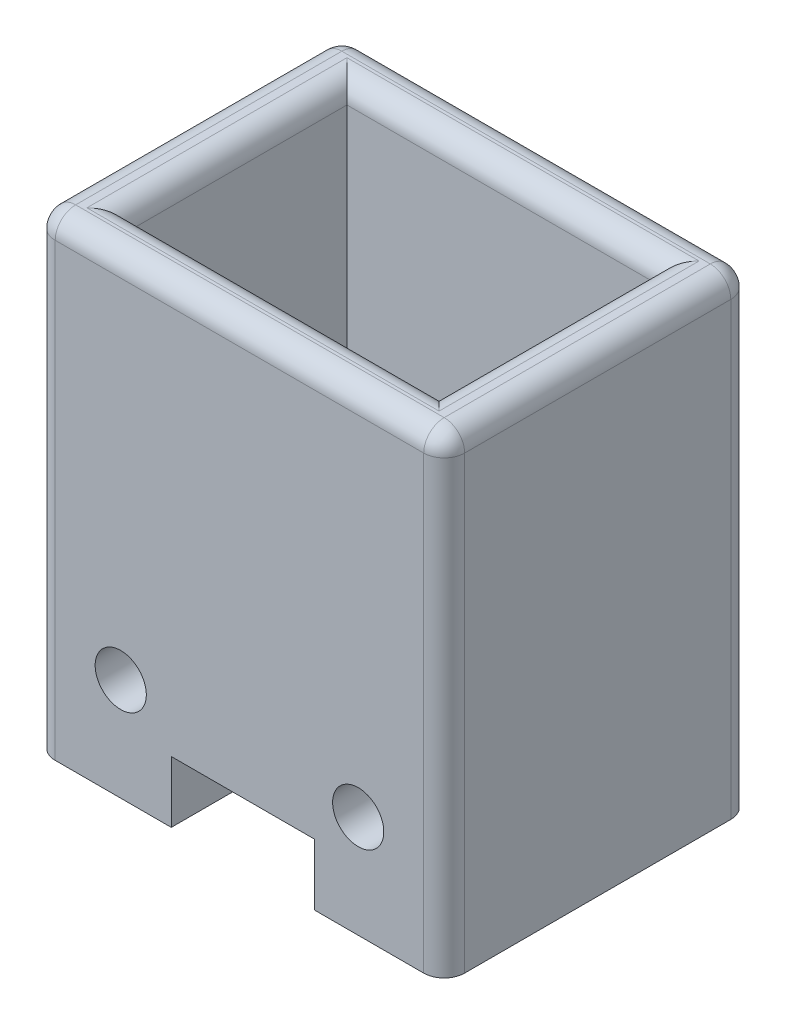
ISO-10303-21;
HEADER;
FILE_DESCRIPTION(('STEP AP214'),'2;1');
FILE_NAME('part.step','',(''),(''),'','','');
FILE_SCHEMA(('AUTOMOTIVE_DESIGN { 1 0 10303 214 1 1 1 1 }'));
ENDSEC;
DATA;
#1=APPLICATION_CONTEXT('core data for automotive mechanical design processes');
#2=APPLICATION_PROTOCOL_DEFINITION('international standard','automotive_design',2000,#1);
#3=PRODUCT_CONTEXT('',#1,'mechanical');
#4=PRODUCT('Part','Part','',(#3));
#5=PRODUCT_RELATED_PRODUCT_CATEGORY('part','',(#4));
#6=PRODUCT_DEFINITION_FORMATION('','',#4);
#7=PRODUCT_DEFINITION_CONTEXT('part definition',#1,'design');
#8=PRODUCT_DEFINITION('design','',#6,#7);
#9=PRODUCT_DEFINITION_SHAPE('','',#8);
#10=(LENGTH_UNIT() NAMED_UNIT(*) SI_UNIT(.MILLI.,.METRE.));
#11=(NAMED_UNIT(*) PLANE_ANGLE_UNIT() SI_UNIT($,.RADIAN.));
#12=(NAMED_UNIT(*) SI_UNIT($,.STERADIAN.) SOLID_ANGLE_UNIT());
#13=UNCERTAINTY_MEASURE_WITH_UNIT(LENGTH_MEASURE(1.E-05),#10,'distance_accuracy_value','');
#14=(GEOMETRIC_REPRESENTATION_CONTEXT(3) GLOBAL_UNCERTAINTY_ASSIGNED_CONTEXT((#13)) GLOBAL_UNIT_ASSIGNED_CONTEXT((#10,
#11,#12)) REPRESENTATION_CONTEXT('',''));
#15=CARTESIAN_POINT('',(0.,0.,0.));
#16=DIRECTION('',(0.,0.,1.));
#17=DIRECTION('',(1.,0.,0.));
#18=AXIS2_PLACEMENT_3D('',#15,#16,#17);
#19=CARTESIAN_POINT('',(0.,0.,0.));
#20=DIRECTION('',(0.,-1.,0.));
#21=DIRECTION('',(0.,0.,-1.));
#22=AXIS2_PLACEMENT_3D('',#19,#20,#21);
#23=PLANE('',#22);
#24=DIRECTION('',(1.,0.,0.));
#25=VECTOR('',#24,1.);
#26=CARTESIAN_POINT('',(-7.6,0.,5.35));
#27=LINE('',#26,#25);
#28=CARTESIAN_POINT('',(-7.6,0.,5.35));
#29=VERTEX_POINT('',#28);
#30=CARTESIAN_POINT('',(-3.33,0.,5.35));
#31=VERTEX_POINT('',#30);
#32=EDGE_CURVE('E285',#29,#31,#27,.T.);
#33=ORIENTED_EDGE('',*,*,#32,.T.);
#34=DIRECTION('',(0.,0.,-1.));
#35=VECTOR('',#34,1.);
#36=CARTESIAN_POINT('',(-3.33,0.,0.));
#37=LINE('',#36,#35);
#38=CARTESIAN_POINT('',(-3.33,0.,2.5));
#39=VERTEX_POINT('',#38);
#40=EDGE_CURVE('E490',#31,#39,#37,.T.);
#41=ORIENTED_EDGE('',*,*,#40,.T.);
#42=DIRECTION('',(-1.,0.,0.));
#43=VECTOR('',#42,1.);
#44=CARTESIAN_POINT('',(-3.33333333333333,0.,2.5));
#45=LINE('',#44,#43);
#46=CARTESIAN_POINT('',(-3.33333333333333,0.,2.5));
#47=VERTEX_POINT('',#46);
#48=EDGE_CURVE('E493',#39,#47,#45,.T.);
#49=ORIENTED_EDGE('',*,*,#48,.T.);
#50=DIRECTION('',(0.,0.,-1.));
#51=VECTOR('',#50,1.);
#52=CARTESIAN_POINT('',(-3.33333333333333,0.,2.5));
#53=LINE('',#52,#51);
#54=CARTESIAN_POINT('',(-3.33333333333333,0.,-2.5));
#55=VERTEX_POINT('',#54);
#56=EDGE_CURVE('E507',#47,#55,#53,.T.);
#57=ORIENTED_EDGE('',*,*,#56,.T.);
#58=DIRECTION('',(1.,0.,0.));
#59=VECTOR('',#58,1.);
#60=CARTESIAN_POINT('',(-3.33333333333333,0.,-2.5));
#61=LINE('',#60,#59);
#62=CARTESIAN_POINT('',(-3.33,0.,-2.5));
#63=VERTEX_POINT('',#62);
#64=EDGE_CURVE('E511',#55,#63,#61,.T.);
#65=ORIENTED_EDGE('',*,*,#64,.T.);
#66=CARTESIAN_POINT('',(-3.33,0.,-5.35));
#67=VERTEX_POINT('',#66);
#68=EDGE_CURVE('E63',#63,#67,#37,.T.);
#69=ORIENTED_EDGE('',*,*,#68,.T.);
#70=DIRECTION('',(-1.,0.,0.));
#71=VECTOR('',#70,1.);
#72=CARTESIAN_POINT('',(-7.6,0.,-5.35));
#73=LINE('',#72,#71);
#74=CARTESIAN_POINT('',(-7.6,0.,-5.35));
#75=VERTEX_POINT('',#74);
#76=EDGE_CURVE('E270',#67,#75,#73,.T.);
#77=ORIENTED_EDGE('',*,*,#76,.T.);
#78=DIRECTION('',(0.,0.,1.));
#79=VECTOR('',#78,1.);
#80=CARTESIAN_POINT('',(-7.6,0.,-5.35));
#81=LINE('',#80,#79);
#82=EDGE_CURVE('E280',#75,#29,#81,.T.);
#83=ORIENTED_EDGE('',*,*,#82,.T.);
#84=EDGE_LOOP('',(#33,#41,#49,#57,#65,#69,#77,#83));
#85=FACE_BOUND('',#84,.T.);
#86=ADVANCED_FACE('F47',(#85),#23,.F.);
#87=CARTESIAN_POINT('',(0.,-2.,0.));
#88=DIRECTION('',(0.,-1.,0.));
#89=DIRECTION('',(0.,0.,-1.));
#90=AXIS2_PLACEMENT_3D('',#87,#88,#89);
#91=PLANE('',#90);
#92=DIRECTION('',(0.,0.,1.));
#93=VECTOR('',#92,1.);
#94=CARTESIAN_POINT('',(-3.33,-2.,-7.5));
#95=LINE('',#94,#93);
#96=CARTESIAN_POINT('',(-3.33,-2.,2.5));
#97=VERTEX_POINT('',#96);
#98=CARTESIAN_POINT('',(-3.33,-2.,7.5));
#99=VERTEX_POINT('',#98);
#100=EDGE_CURVE('E244',#97,#99,#95,.T.);
#101=ORIENTED_EDGE('',*,*,#100,.T.);
#102=DIRECTION('',(-1.,0.,0.));
#103=VECTOR('',#102,1.);
#104=CARTESIAN_POINT('',(-10.,-2.,7.5));
#105=LINE('',#104,#103);
#106=CARTESIAN_POINT('',(-9.,-2.,7.5));
#107=VERTEX_POINT('',#106);
#108=EDGE_CURVE('E530',#99,#107,#105,.T.);
#109=ORIENTED_EDGE('',*,*,#108,.T.);
#110=CARTESIAN_POINT('',(-9.,-2.,6.5));
#111=DIRECTION('',(0.,-1.,0.));
#112=DIRECTION('',(0.,0.,-1.));
#113=AXIS2_PLACEMENT_3D('',#110,#111,#112);
#114=CIRCLE('',#113,1.);
#115=CARTESIAN_POINT('',(-10.,-2.,6.5));
#116=VERTEX_POINT('',#115);
#117=EDGE_CURVE('E393',#107,#116,#114,.T.);
#118=ORIENTED_EDGE('',*,*,#117,.T.);
#119=DIRECTION('',(0.,0.,-1.));
#120=VECTOR('',#119,1.);
#121=CARTESIAN_POINT('',(-10.,-2.,7.5));
#122=LINE('',#121,#120);
#123=CARTESIAN_POINT('',(-10.,-2.,-6.5));
#124=VERTEX_POINT('',#123);
#125=EDGE_CURVE('E272',#116,#124,#122,.T.);
#126=ORIENTED_EDGE('',*,*,#125,.T.);
#127=CARTESIAN_POINT('',(-9.00000000000001,-2.,-6.5));
#128=DIRECTION('',(0.,-1.,0.));
#129=DIRECTION('',(0.,0.,-1.));
#130=AXIS2_PLACEMENT_3D('',#127,#128,#129);
#131=CIRCLE('',#130,1.);
#132=CARTESIAN_POINT('',(-9.00000000000001,-2.,-7.5));
#133=VERTEX_POINT('',#132);
#134=EDGE_CURVE('E262',#124,#133,#131,.T.);
#135=ORIENTED_EDGE('',*,*,#134,.T.);
#136=DIRECTION('',(1.,0.,0.));
#137=VECTOR('',#136,1.);
#138=CARTESIAN_POINT('',(-10.,-2.,-7.5));
#139=LINE('',#138,#137);
#140=CARTESIAN_POINT('',(-3.33,-2.,-7.5));
#141=VERTEX_POINT('',#140);
#142=EDGE_CURVE('E249',#133,#141,#139,.T.);
#143=ORIENTED_EDGE('',*,*,#142,.T.);
#144=CARTESIAN_POINT('',(-3.33,-2.,-2.5));
#145=VERTEX_POINT('',#144);
#146=EDGE_CURVE('E232',#141,#145,#95,.T.);
#147=ORIENTED_EDGE('',*,*,#146,.T.);
#148=DIRECTION('',(1.,0.,0.));
#149=VECTOR('',#148,1.);
#150=CARTESIAN_POINT('',(-3.33333333333333,-2.,-2.5));
#151=LINE('',#150,#149);
#152=CARTESIAN_POINT('',(-3.33333333333333,-2.,-2.5));
#153=VERTEX_POINT('',#152);
#154=EDGE_CURVE('E516',#153,#145,#151,.T.);
#155=ORIENTED_EDGE('',*,*,#154,.F.);
#156=DIRECTION('',(0.,0.,-1.));
#157=VECTOR('',#156,1.);
#158=CARTESIAN_POINT('',(-3.33333333333333,-2.,2.5));
#159=LINE('',#158,#157);
#160=CARTESIAN_POINT('',(-3.33333333333333,-2.,2.5));
#161=VERTEX_POINT('',#160);
#162=EDGE_CURVE('E631',#161,#153,#159,.T.);
#163=ORIENTED_EDGE('',*,*,#162,.F.);
#164=DIRECTION('',(-1.,0.,0.));
#165=VECTOR('',#164,1.);
#166=CARTESIAN_POINT('',(-3.33333333333333,-2.,2.5));
#167=LINE('',#166,#165);
#168=EDGE_CURVE('E521',#97,#161,#167,.T.);
#169=ORIENTED_EDGE('',*,*,#168,.F.);
#170=EDGE_LOOP('',(#101,#109,#118,#126,#135,#143,#147,#155,#163,#169));
#171=FACE_BOUND('',#170,.T.);
#172=ADVANCED_FACE('F259',(#171),#91,.T.);
#173=CARTESIAN_POINT('',(0.,21.,0.));
#174=DIRECTION('',(0.,1.,0.));
#175=DIRECTION('',(0.,0.,1.));
#176=AXIS2_PLACEMENT_3D('',#173,#174,#175);
#177=PLANE('',#176);
#178=DIRECTION('',(1.,0.,0.));
#179=VECTOR('',#178,1.);
#180=CARTESIAN_POINT('',(0.,21.,6.35));
#181=LINE('',#180,#179);
#182=CARTESIAN_POINT('',(8.6,21.,6.35));
#183=VERTEX_POINT('',#182);
#184=CARTESIAN_POINT('',(-8.6,21.,6.35));
#185=VERTEX_POINT('',#184);
#186=EDGE_CURVE('E337',#183,#185,#181,.F.);
#187=ORIENTED_EDGE('',*,*,#186,.T.);
#188=DIRECTION('',(0.,0.,1.));
#189=VECTOR('',#188,1.);
#190=CARTESIAN_POINT('',(-8.6,21.,0.));
#191=LINE('',#190,#189);
#192=CARTESIAN_POINT('',(-8.6,21.,-6.35));
#193=VERTEX_POINT('',#192);
#194=EDGE_CURVE('E340',#185,#193,#191,.F.);
#195=ORIENTED_EDGE('',*,*,#194,.T.);
#196=DIRECTION('',(-1.,0.,0.));
#197=VECTOR('',#196,1.);
#198=CARTESIAN_POINT('',(0.,21.,-6.35));
#199=LINE('',#198,#197);
#200=CARTESIAN_POINT('',(8.6,21.,-6.35));
#201=VERTEX_POINT('',#200);
#202=EDGE_CURVE('E331',#193,#201,#199,.F.);
#203=ORIENTED_EDGE('',*,*,#202,.T.);
#204=DIRECTION('',(0.,0.,-1.));
#205=VECTOR('',#204,1.);
#206=CARTESIAN_POINT('',(8.6,21.,0.));
#207=LINE('',#206,#205);
#208=EDGE_CURVE('E334',#201,#183,#207,.F.);
#209=ORIENTED_EDGE('',*,*,#208,.T.);
#210=EDGE_LOOP('',(#187,#195,#203,#209));
#211=FACE_BOUND('',#210,.T.);
#212=DIRECTION('',(0.,0.,1.));
#213=VECTOR('',#212,1.);
#214=CARTESIAN_POINT('',(-9.,21.,7.5));
#215=LINE('',#214,#213);
#216=CARTESIAN_POINT('',(-9.00000000000001,21.,-6.5));
#217=VERTEX_POINT('',#216);
#218=CARTESIAN_POINT('',(-9.,21.,6.5));
#219=VERTEX_POINT('',#218);
#220=EDGE_CURVE('E324',#217,#219,#215,.T.);
#221=ORIENTED_EDGE('',*,*,#220,.T.);
#222=DIRECTION('',(1.,0.,0.));
#223=VECTOR('',#222,1.);
#224=CARTESIAN_POINT('',(10.,21.,6.5));
#225=LINE('',#224,#223);
#226=CARTESIAN_POINT('',(9.,21.,6.5));
#227=VERTEX_POINT('',#226);
#228=EDGE_CURVE('E327',#219,#227,#225,.T.);
#229=ORIENTED_EDGE('',*,*,#228,.T.);
#230=DIRECTION('',(0.,0.,-1.));
#231=VECTOR('',#230,1.);
#232=CARTESIAN_POINT('',(9.,21.,-7.5));
#233=LINE('',#232,#231);
#234=CARTESIAN_POINT('',(9.,21.,-6.5));
#235=VERTEX_POINT('',#234);
#236=EDGE_CURVE('E318',#227,#235,#233,.T.);
#237=ORIENTED_EDGE('',*,*,#236,.T.);
#238=DIRECTION('',(-1.,0.,0.));
#239=VECTOR('',#238,1.);
#240=CARTESIAN_POINT('',(-10.,21.,-6.5));
#241=LINE('',#240,#239);
#242=EDGE_CURVE('E321',#235,#217,#241,.T.);
#243=ORIENTED_EDGE('',*,*,#242,.T.);
#244=EDGE_LOOP('',(#221,#229,#237,#243));
#245=FACE_BOUND('',#244,.T.);
#246=ADVANCED_FACE('F658',(#211,#245),#177,.T.);
#247=CARTESIAN_POINT('',(10.,21.,-7.5));
#248=DIRECTION('',(-1.,0.,0.));
#249=DIRECTION('',(0.,0.,1.));
#250=AXIS2_PLACEMENT_3D('',#247,#248,#249);
#251=PLANE('',#250);
#252=DIRECTION('',(0.,0.,1.));
#253=VECTOR('',#252,1.);
#254=CARTESIAN_POINT('',(10.,-2.,7.5));
#255=LINE('',#254,#253);
#256=CARTESIAN_POINT('',(10.,-2.,-6.5));
#257=VERTEX_POINT('',#256);
#258=CARTESIAN_POINT('',(10.,-2.,6.5));
#259=VERTEX_POINT('',#258);
#260=EDGE_CURVE('E527',#257,#259,#255,.T.);
#261=ORIENTED_EDGE('',*,*,#260,.F.);
#262=DIRECTION('',(0.,-1.,0.));
#263=VECTOR('',#262,1.);
#264=CARTESIAN_POINT('',(10.,21.,-6.5));
#265=LINE('',#264,#263);
#266=CARTESIAN_POINT('',(10.,20.,-6.5));
#267=VERTEX_POINT('',#266);
#268=EDGE_CURVE('E71',#257,#267,#265,.F.);
#269=ORIENTED_EDGE('',*,*,#268,.T.);
#270=DIRECTION('',(0.,0.,-1.));
#271=VECTOR('',#270,1.);
#272=CARTESIAN_POINT('',(10.,20.,7.5));
#273=LINE('',#272,#271);
#274=CARTESIAN_POINT('',(10.,20.,6.5));
#275=VERTEX_POINT('',#274);
#276=EDGE_CURVE('E386',#267,#275,#273,.F.);
#277=ORIENTED_EDGE('',*,*,#276,.T.);
#278=DIRECTION('',(0.,-1.,0.));
#279=VECTOR('',#278,1.);
#280=CARTESIAN_POINT('',(10.,21.,6.5));
#281=LINE('',#280,#279);
#282=EDGE_CURVE('E383',#275,#259,#281,.T.);
#283=ORIENTED_EDGE('',*,*,#282,.T.);
#284=EDGE_LOOP('',(#261,#269,#277,#283));
#285=FACE_BOUND('',#284,.T.);
#286=ADVANCED_FACE('F772',(#285),#251,.F.);
#287=CARTESIAN_POINT('',(-10.,21.,-7.5));
#288=DIRECTION('',(0.,0.,1.));
#289=DIRECTION('',(1.,0.,0.));
#290=AXIS2_PLACEMENT_3D('',#287,#288,#289);
#291=PLANE('',#290);
#292=CARTESIAN_POINT('',(-5.80000000000015,2.99999999999671,-7.5));
#293=DIRECTION('',(0.,0.,-1.));
#294=DIRECTION('',(-1.,0.,0.));
#295=AXIS2_PLACEMENT_3D('',#292,#293,#294);
#296=CIRCLE('',#295,1.24999999999906);
#297=CARTESIAN_POINT('',(-7.04999999999921,2.99999999999671,-7.5));
#298=VERTEX_POINT('',#297);
#299=EDGE_CURVE('E616',#298,#298,#296,.T.);
#300=ORIENTED_EDGE('',*,*,#299,.F.);
#301=EDGE_LOOP('',(#300));
#302=FACE_BOUND('',#301,.T.);
#303=CARTESIAN_POINT('',(5.79999999999985,2.99999999999671,-7.5));
#304=DIRECTION('',(0.,0.,-1.));
#305=DIRECTION('',(-1.,0.,0.));
#306=AXIS2_PLACEMENT_3D('',#303,#304,#305);
#307=CIRCLE('',#306,1.24999999999906);
#308=CARTESIAN_POINT('',(4.55000000000079,2.99999999999671,-7.5));
#309=VERTEX_POINT('',#308);
#310=EDGE_CURVE('E620',#309,#309,#307,.T.);
#311=ORIENTED_EDGE('',*,*,#310,.F.);
#312=EDGE_LOOP('',(#311));
#313=FACE_BOUND('',#312,.T.);
#314=DIRECTION('',(-1.,0.,0.));
#315=VECTOR('',#314,1.);
#316=CARTESIAN_POINT('',(-3.33,1.,-7.5));
#317=LINE('',#316,#315);
#318=CARTESIAN_POINT('',(3.67,1.,-7.5));
#319=VERTEX_POINT('',#318);
#320=CARTESIAN_POINT('',(-3.33,1.,-7.5));
#321=VERTEX_POINT('',#320);
#322=EDGE_CURVE('E253',#319,#321,#317,.T.);
#323=ORIENTED_EDGE('',*,*,#322,.T.);
#324=DIRECTION('',(0.,-1.,0.));
#325=VECTOR('',#324,1.);
#326=CARTESIAN_POINT('',(-3.33,-2.,-7.5));
#327=LINE('',#326,#325);
#328=EDGE_CURVE('E236',#321,#141,#327,.T.);
#329=ORIENTED_EDGE('',*,*,#328,.T.);
#330=ORIENTED_EDGE('',*,*,#142,.F.);
#331=DIRECTION('',(0.,-1.,0.));
#332=VECTOR('',#331,1.);
#333=CARTESIAN_POINT('',(-9.00000000000001,21.,-7.5));
#334=LINE('',#333,#332);
#335=CARTESIAN_POINT('',(-9.00000000000001,20.,-7.5));
#336=VERTEX_POINT('',#335);
#337=EDGE_CURVE('E373',#133,#336,#334,.F.);
#338=ORIENTED_EDGE('',*,*,#337,.T.);
#339=DIRECTION('',(-1.,0.,0.));
#340=VECTOR('',#339,1.);
#341=CARTESIAN_POINT('',(10.,20.,-7.5));
#342=LINE('',#341,#340);
#343=CARTESIAN_POINT('',(9.,20.,-7.5));
#344=VERTEX_POINT('',#343);
#345=EDGE_CURVE('E376',#336,#344,#342,.F.);
#346=ORIENTED_EDGE('',*,*,#345,.T.);
#347=DIRECTION('',(0.,-1.,0.));
#348=VECTOR('',#347,1.);
#349=CARTESIAN_POINT('',(9.,21.,-7.5));
#350=LINE('',#349,#348);
#351=CARTESIAN_POINT('',(9.,-2.,-7.5));
#352=VERTEX_POINT('',#351);
#353=EDGE_CURVE('E379',#344,#352,#350,.T.);
#354=ORIENTED_EDGE('',*,*,#353,.T.);
#355=CARTESIAN_POINT('',(3.67,-2.,-7.5));
#356=VERTEX_POINT('',#355);
#357=EDGE_CURVE('E265',#356,#352,#139,.T.);
#358=ORIENTED_EDGE('',*,*,#357,.F.);
#359=DIRECTION('',(0.,1.,0.));
#360=VECTOR('',#359,1.);
#361=CARTESIAN_POINT('',(3.67,-2.,-7.5));
#362=LINE('',#361,#360);
#363=EDGE_CURVE('E255',#356,#319,#362,.T.);
#364=ORIENTED_EDGE('',*,*,#363,.T.);
#365=EDGE_LOOP('',(#323,#329,#330,#338,#346,#354,#358,#364));
#366=FACE_BOUND('',#365,.T.);
#367=ADVANCED_FACE('F248',(#302,#313,#366),#291,.F.);
#368=CARTESIAN_POINT('',(-10.,21.,-7.5));
#369=DIRECTION('',(1.,0.,0.));
#370=DIRECTION('',(0.,0.,-1.));
#371=AXIS2_PLACEMENT_3D('',#368,#369,#370);
#372=PLANE('',#371);
#373=ORIENTED_EDGE('',*,*,#125,.F.);
#374=DIRECTION('',(0.,-1.,0.));
#375=VECTOR('',#374,1.);
#376=CARTESIAN_POINT('',(-10.,21.,6.5));
#377=LINE('',#376,#375);
#378=CARTESIAN_POINT('',(-10.,20.,6.5));
#379=VERTEX_POINT('',#378);
#380=EDGE_CURVE('E370',#116,#379,#377,.F.);
#381=ORIENTED_EDGE('',*,*,#380,.T.);
#382=DIRECTION('',(0.,0.,1.));
#383=VECTOR('',#382,1.);
#384=CARTESIAN_POINT('',(-10.,20.,-7.5));
#385=LINE('',#384,#383);
#386=CARTESIAN_POINT('',(-10.,20.,-6.5));
#387=VERTEX_POINT('',#386);
#388=EDGE_CURVE('E367',#379,#387,#385,.F.);
#389=ORIENTED_EDGE('',*,*,#388,.T.);
#390=DIRECTION('',(0.,-1.,0.));
#391=VECTOR('',#390,1.);
#392=CARTESIAN_POINT('',(-10.,21.,-6.5));
#393=LINE('',#392,#391);
#394=EDGE_CURVE('E364',#387,#124,#393,.T.);
#395=ORIENTED_EDGE('',*,*,#394,.T.);
#396=EDGE_LOOP('',(#373,#381,#389,#395));
#397=FACE_BOUND('',#396,.T.);
#398=ADVANCED_FACE('F553',(#397),#372,.F.);
#399=CARTESIAN_POINT('',(-10.,21.,7.5));
#400=DIRECTION('',(0.,0.,-1.));
#401=DIRECTION('',(-1.,0.,0.));
#402=AXIS2_PLACEMENT_3D('',#399,#400,#401);
#403=PLANE('',#402);
#404=CARTESIAN_POINT('',(-5.80000000000015,2.99999999999671,7.5));
#405=DIRECTION('',(0.,0.,-1.));
#406=DIRECTION('',(-1.,0.,0.));
#407=AXIS2_PLACEMENT_3D('',#404,#405,#406);
#408=CIRCLE('',#407,1.24999999999906);
#409=CARTESIAN_POINT('',(-7.04999999999921,2.99999999999671,7.5));
#410=VERTEX_POINT('',#409);
#411=EDGE_CURVE('E309',#410,#410,#408,.T.);
#412=ORIENTED_EDGE('',*,*,#411,.T.);
#413=EDGE_LOOP('',(#412));
#414=FACE_BOUND('',#413,.T.);
#415=CARTESIAN_POINT('',(5.79999999999985,2.99999999999671,7.5));
#416=DIRECTION('',(0.,0.,-1.));
#417=DIRECTION('',(-1.,0.,0.));
#418=AXIS2_PLACEMENT_3D('',#415,#416,#417);
#419=CIRCLE('',#418,1.24999999999906);
#420=CARTESIAN_POINT('',(4.55000000000079,2.99999999999671,7.5));
#421=VERTEX_POINT('',#420);
#422=EDGE_CURVE('E417',#421,#421,#419,.T.);
#423=ORIENTED_EDGE('',*,*,#422,.T.);
#424=EDGE_LOOP('',(#423));
#425=FACE_BOUND('',#424,.T.);
#426=ORIENTED_EDGE('',*,*,#108,.F.);
#427=DIRECTION('',(0.,-1.,0.));
#428=VECTOR('',#427,1.);
#429=CARTESIAN_POINT('',(-3.33,-2.,7.5));
#430=LINE('',#429,#428);
#431=CARTESIAN_POINT('',(-3.33,1.,7.5));
#432=VERTEX_POINT('',#431);
#433=EDGE_CURVE('E689',#432,#99,#430,.T.);
#434=ORIENTED_EDGE('',*,*,#433,.F.);
#435=DIRECTION('',(-1.,0.,0.));
#436=VECTOR('',#435,1.);
#437=CARTESIAN_POINT('',(-3.33,1.,7.5));
#438=LINE('',#437,#436);
#439=CARTESIAN_POINT('',(3.67,1.,7.5));
#440=VERTEX_POINT('',#439);
#441=EDGE_CURVE('E256',#440,#432,#438,.T.);
#442=ORIENTED_EDGE('',*,*,#441,.F.);
#443=DIRECTION('',(0.,1.,0.));
#444=VECTOR('',#443,1.);
#445=CARTESIAN_POINT('',(3.67,-2.,7.5));
#446=LINE('',#445,#444);
#447=CARTESIAN_POINT('',(3.67,-2.,7.5));
#448=VERTEX_POINT('',#447);
#449=EDGE_CURVE('E686',#448,#440,#446,.T.);
#450=ORIENTED_EDGE('',*,*,#449,.F.);
#451=CARTESIAN_POINT('',(9.,-2.,7.5));
#452=VERTEX_POINT('',#451);
#453=EDGE_CURVE('E531',#452,#448,#105,.T.);
#454=ORIENTED_EDGE('',*,*,#453,.F.);
#455=DIRECTION('',(0.,-1.,0.));
#456=VECTOR('',#455,1.);
#457=CARTESIAN_POINT('',(9.,21.,7.5));
#458=LINE('',#457,#456);
#459=CARTESIAN_POINT('',(9.,20.,7.5));
#460=VERTEX_POINT('',#459);
#461=EDGE_CURVE('E361',#452,#460,#458,.F.);
#462=ORIENTED_EDGE('',*,*,#461,.T.);
#463=DIRECTION('',(1.,0.,0.));
#464=VECTOR('',#463,1.);
#465=CARTESIAN_POINT('',(-10.,20.,7.5));
#466=LINE('',#465,#464);
#467=CARTESIAN_POINT('',(-9.,20.,7.5));
#468=VERTEX_POINT('',#467);
#469=EDGE_CURVE('E357',#460,#468,#466,.F.);
#470=ORIENTED_EDGE('',*,*,#469,.T.);
#471=DIRECTION('',(0.,-1.,0.));
#472=VECTOR('',#471,1.);
#473=CARTESIAN_POINT('',(-9.,21.,7.5));
#474=LINE('',#473,#472);
#475=EDGE_CURVE('E353',#468,#107,#474,.T.);
#476=ORIENTED_EDGE('',*,*,#475,.T.);
#477=EDGE_LOOP('',(#426,#434,#442,#450,#454,#462,#470,#476));
#478=FACE_BOUND('',#477,.T.);
#479=ADVANCED_FACE('F545',(#414,#425,#478),#403,.F.);
#480=CARTESIAN_POINT('',(7.6,21.,-5.35));
#481=DIRECTION('',(-1.,0.,0.));
#482=DIRECTION('',(0.,0.,1.));
#483=AXIS2_PLACEMENT_3D('',#480,#481,#482);
#484=PLANE('',#483);
#485=DIRECTION('',(0.,-1.,0.));
#486=VECTOR('',#485,1.);
#487=CARTESIAN_POINT('',(7.6,21.,5.35));
#488=LINE('',#487,#486);
#489=CARTESIAN_POINT('',(7.6,20.,5.35));
#490=VERTEX_POINT('',#489);
#491=CARTESIAN_POINT('',(7.6,0.,5.35));
#492=VERTEX_POINT('',#491);
#493=EDGE_CURVE('E289',#490,#492,#488,.T.);
#494=ORIENTED_EDGE('',*,*,#493,.F.);
#495=DIRECTION('',(0.,0.,-1.));
#496=VECTOR('',#495,1.);
#497=CARTESIAN_POINT('',(7.6,20.,-5.35));
#498=LINE('',#497,#496);
#499=CARTESIAN_POINT('',(7.6,20.,-5.35));
#500=VERTEX_POINT('',#499);
#501=EDGE_CURVE('E347',#490,#500,#498,.T.);
#502=ORIENTED_EDGE('',*,*,#501,.T.);
#503=DIRECTION('',(0.,-1.,0.));
#504=VECTOR('',#503,1.);
#505=CARTESIAN_POINT('',(7.6,21.,-5.35));
#506=LINE('',#505,#504);
#507=CARTESIAN_POINT('',(7.6,0.,-5.35));
#508=VERTEX_POINT('',#507);
#509=EDGE_CURVE('E300',#500,#508,#506,.T.);
#510=ORIENTED_EDGE('',*,*,#509,.T.);
#511=DIRECTION('',(0.,0.,-1.));
#512=VECTOR('',#511,1.);
#513=CARTESIAN_POINT('',(7.6,0.,-5.35));
#514=LINE('',#513,#512);
#515=EDGE_CURVE('E264',#492,#508,#514,.T.);
#516=ORIENTED_EDGE('',*,*,#515,.F.);
#517=EDGE_LOOP('',(#494,#502,#510,#516));
#518=FACE_BOUND('',#517,.T.);
#519=ADVANCED_FACE('F706',(#518),#484,.T.);
#520=CARTESIAN_POINT('',(-7.6,21.,-5.35));
#521=DIRECTION('',(0.,0.,1.));
#522=DIRECTION('',(1.,0.,0.));
#523=AXIS2_PLACEMENT_3D('',#520,#521,#522);
#524=PLANE('',#523);
#525=DIRECTION('',(0.,-1.,0.));
#526=VECTOR('',#525,1.);
#527=CARTESIAN_POINT('',(-3.32999999999999,21.,-5.35));
#528=LINE('',#527,#526);
#529=CARTESIAN_POINT('',(-3.33,1.,-5.35));
#530=VERTEX_POINT('',#529);
#531=EDGE_CURVE('E593',#530,#67,#528,.T.);
#532=ORIENTED_EDGE('',*,*,#531,.F.);
#533=DIRECTION('',(-1.,0.,0.));
#534=VECTOR('',#533,1.);
#535=CARTESIAN_POINT('',(-7.6,1.,-5.35));
#536=LINE('',#535,#534);
#537=CARTESIAN_POINT('',(3.67,1.,-5.35));
#538=VERTEX_POINT('',#537);
#539=EDGE_CURVE('E422',#538,#530,#536,.T.);
#540=ORIENTED_EDGE('',*,*,#539,.F.);
#541=DIRECTION('',(0.,1.,0.));
#542=VECTOR('',#541,1.);
#543=CARTESIAN_POINT('',(3.67,21.,-5.35));
#544=LINE('',#543,#542);
#545=CARTESIAN_POINT('',(3.67,0.,-5.35));
#546=VERTEX_POINT('',#545);
#547=EDGE_CURVE('E608',#546,#538,#544,.T.);
#548=ORIENTED_EDGE('',*,*,#547,.F.);
#549=EDGE_CURVE('E276',#508,#546,#73,.T.);
#550=ORIENTED_EDGE('',*,*,#549,.F.);
#551=ORIENTED_EDGE('',*,*,#509,.F.);
#552=DIRECTION('',(-1.,0.,0.));
#553=VECTOR('',#552,1.);
#554=CARTESIAN_POINT('',(-7.6,20.,-5.35));
#555=LINE('',#554,#553);
#556=CARTESIAN_POINT('',(-7.6,20.,-5.35));
#557=VERTEX_POINT('',#556);
#558=EDGE_CURVE('E350',#500,#557,#555,.T.);
#559=ORIENTED_EDGE('',*,*,#558,.T.);
#560=DIRECTION('',(0.,-1.,0.));
#561=VECTOR('',#560,1.);
#562=CARTESIAN_POINT('',(-7.6,21.,-5.35));
#563=LINE('',#562,#561);
#564=EDGE_CURVE('E296',#557,#75,#563,.T.);
#565=ORIENTED_EDGE('',*,*,#564,.T.);
#566=ORIENTED_EDGE('',*,*,#76,.F.);
#567=EDGE_LOOP('',(#532,#540,#548,#550,#551,#559,#565,#566));
#568=FACE_BOUND('',#567,.T.);
#569=CARTESIAN_POINT('',(-5.80000000000015,2.99999999999671,-5.35));
#570=DIRECTION('',(0.,0.,1.));
#571=DIRECTION('',(1.,0.,0.));
#572=AXIS2_PLACEMENT_3D('',#569,#570,#571);
#573=CIRCLE('',#572,1.24999999999906);
#574=CARTESIAN_POINT('',(-4.55000000000109,2.99999999999671,-5.35));
#575=VERTEX_POINT('',#574);
#576=EDGE_CURVE('E314',#575,#575,#573,.T.);
#577=ORIENTED_EDGE('',*,*,#576,.F.);
#578=EDGE_LOOP('',(#577));
#579=FACE_BOUND('',#578,.T.);
#580=CARTESIAN_POINT('',(5.79999999999985,2.99999999999671,-5.35));
#581=DIRECTION('',(0.,0.,1.));
#582=DIRECTION('',(1.,0.,0.));
#583=AXIS2_PLACEMENT_3D('',#580,#581,#582);
#584=CIRCLE('',#583,1.24999999999906);
#585=CARTESIAN_POINT('',(7.04999999999891,2.99999999999671,-5.35));
#586=VERTEX_POINT('',#585);
#587=EDGE_CURVE('E308',#586,#586,#584,.T.);
#588=ORIENTED_EDGE('',*,*,#587,.F.);
#589=EDGE_LOOP('',(#588));
#590=FACE_BOUND('',#589,.T.);
#591=ADVANCED_FACE('F473',(#568,#579,#590),#524,.T.);
#592=CARTESIAN_POINT('',(-7.6,21.,-5.35));
#593=DIRECTION('',(1.,0.,0.));
#594=DIRECTION('',(0.,0.,-1.));
#595=AXIS2_PLACEMENT_3D('',#592,#593,#594);
#596=PLANE('',#595);
#597=ORIENTED_EDGE('',*,*,#564,.F.);
#598=DIRECTION('',(0.,0.,1.));
#599=VECTOR('',#598,1.);
#600=CARTESIAN_POINT('',(-7.6,20.,-5.35));
#601=LINE('',#600,#599);
#602=CARTESIAN_POINT('',(-7.6,20.,5.35));
#603=VERTEX_POINT('',#602);
#604=EDGE_CURVE('E303',#557,#603,#601,.T.);
#605=ORIENTED_EDGE('',*,*,#604,.T.);
#606=DIRECTION('',(0.,-1.,0.));
#607=VECTOR('',#606,1.);
#608=CARTESIAN_POINT('',(-7.6,21.,5.35));
#609=LINE('',#608,#607);
#610=EDGE_CURVE('E293',#603,#29,#609,.T.);
#611=ORIENTED_EDGE('',*,*,#610,.T.);
#612=ORIENTED_EDGE('',*,*,#82,.F.);
#613=EDGE_LOOP('',(#597,#605,#611,#612));
#614=FACE_BOUND('',#613,.T.);
#615=ADVANCED_FACE('F479',(#614),#596,.T.);
#616=CARTESIAN_POINT('',(-7.6,21.,5.35));
#617=DIRECTION('',(0.,0.,-1.));
#618=DIRECTION('',(-1.,0.,0.));
#619=AXIS2_PLACEMENT_3D('',#616,#617,#618);
#620=PLANE('',#619);
#621=DIRECTION('',(0.,1.,0.));
#622=VECTOR('',#621,1.);
#623=CARTESIAN_POINT('',(-3.32999999999999,21.,5.35));
#624=LINE('',#623,#622);
#625=CARTESIAN_POINT('',(-3.33,1.,5.35));
#626=VERTEX_POINT('',#625);
#627=EDGE_CURVE('E488',#31,#626,#624,.T.);
#628=ORIENTED_EDGE('',*,*,#627,.F.);
#629=ORIENTED_EDGE('',*,*,#32,.F.);
#630=ORIENTED_EDGE('',*,*,#610,.F.);
#631=DIRECTION('',(1.,0.,0.));
#632=VECTOR('',#631,1.);
#633=CARTESIAN_POINT('',(-7.6,20.,5.35));
#634=LINE('',#633,#632);
#635=EDGE_CURVE('E344',#603,#490,#634,.T.);
#636=ORIENTED_EDGE('',*,*,#635,.T.);
#637=ORIENTED_EDGE('',*,*,#493,.T.);
#638=CARTESIAN_POINT('',(3.67,0.,5.35));
#639=VERTEX_POINT('',#638);
#640=EDGE_CURVE('E284',#639,#492,#27,.T.);
#641=ORIENTED_EDGE('',*,*,#640,.F.);
#642=DIRECTION('',(0.,-1.,0.));
#643=VECTOR('',#642,1.);
#644=CARTESIAN_POINT('',(3.67000000000001,21.,5.35));
#645=LINE('',#644,#643);
#646=CARTESIAN_POINT('',(3.67,1.,5.35));
#647=VERTEX_POINT('',#646);
#648=EDGE_CURVE('E605',#647,#639,#645,.T.);
#649=ORIENTED_EDGE('',*,*,#648,.F.);
#650=DIRECTION('',(1.,0.,0.));
#651=VECTOR('',#650,1.);
#652=CARTESIAN_POINT('',(-7.6,1.,5.35));
#653=LINE('',#652,#651);
#654=EDGE_CURVE('E11',#626,#647,#653,.T.);
#655=ORIENTED_EDGE('',*,*,#654,.F.);
#656=EDGE_LOOP('',(#628,#629,#630,#636,#637,#641,#649,#655));
#657=FACE_BOUND('',#656,.T.);
#658=CARTESIAN_POINT('',(-5.80000000000015,2.99999999999671,5.35));
#659=DIRECTION('',(0.,0.,-1.));
#660=DIRECTION('',(-1.,0.,0.));
#661=AXIS2_PLACEMENT_3D('',#658,#659,#660);
#662=CIRCLE('',#661,1.24999999999906);
#663=CARTESIAN_POINT('',(-7.04999999999921,2.99999999999671,5.35));
#664=VERTEX_POINT('',#663);
#665=EDGE_CURVE('E310',#664,#664,#662,.T.);
#666=ORIENTED_EDGE('',*,*,#665,.F.);
#667=EDGE_LOOP('',(#666));
#668=FACE_BOUND('',#667,.T.);
#669=CARTESIAN_POINT('',(5.79999999999985,2.99999999999671,5.35));
#670=DIRECTION('',(0.,0.,-1.));
#671=DIRECTION('',(-1.,0.,0.));
#672=AXIS2_PLACEMENT_3D('',#669,#670,#671);
#673=CIRCLE('',#672,1.24999999999906);
#674=CARTESIAN_POINT('',(4.55000000000079,2.99999999999671,5.35));
#675=VERTEX_POINT('',#674);
#676=EDGE_CURVE('E304',#675,#675,#673,.T.);
#677=ORIENTED_EDGE('',*,*,#676,.F.);
#678=EDGE_LOOP('',(#677));
#679=FACE_BOUND('',#678,.T.);
#680=ADVANCED_FACE('F485',(#657,#668,#679),#620,.T.);
#681=ORIENTED_EDGE('',*,*,#549,.T.);
#682=DIRECTION('',(0.,0.,1.));
#683=VECTOR('',#682,1.);
#684=CARTESIAN_POINT('',(3.67,0.,0.));
#685=LINE('',#684,#683);
#686=EDGE_CURVE('E601',#546,#639,#685,.T.);
#687=ORIENTED_EDGE('',*,*,#686,.T.);
#688=ORIENTED_EDGE('',*,*,#640,.T.);
#689=ORIENTED_EDGE('',*,*,#515,.T.);
#690=EDGE_LOOP('',(#681,#687,#688,#689));
#691=FACE_BOUND('',#690,.T.);
#692=ADVANCED_FACE('F653',(#691),#23,.F.);
#693=DIRECTION('',(0.,0.,1.));
#694=VECTOR('',#693,1.);
#695=CARTESIAN_POINT('',(3.67,-2.,-7.5));
#696=LINE('',#695,#694);
#697=EDGE_CURVE('E243',#356,#448,#696,.T.);
#698=ORIENTED_EDGE('',*,*,#697,.F.);
#699=ORIENTED_EDGE('',*,*,#357,.T.);
#700=CARTESIAN_POINT('',(9.,-2.,-6.5));
#701=DIRECTION('',(0.,-1.,0.));
#702=DIRECTION('',(0.,0.,-1.));
#703=AXIS2_PLACEMENT_3D('',#700,#701,#702);
#704=CIRCLE('',#703,1.);
#705=EDGE_CURVE('E399',#352,#257,#704,.T.);
#706=ORIENTED_EDGE('',*,*,#705,.T.);
#707=ORIENTED_EDGE('',*,*,#260,.T.);
#708=CARTESIAN_POINT('',(9.,-2.,6.5));
#709=DIRECTION('',(0.,-1.,0.));
#710=DIRECTION('',(0.,0.,-1.));
#711=AXIS2_PLACEMENT_3D('',#708,#709,#710);
#712=CIRCLE('',#711,1.);
#713=EDGE_CURVE('E396',#259,#452,#712,.T.);
#714=ORIENTED_EDGE('',*,*,#713,.T.);
#715=ORIENTED_EDGE('',*,*,#453,.T.);
#716=EDGE_LOOP('',(#698,#699,#706,#707,#714,#715));
#717=FACE_BOUND('',#716,.T.);
#718=ADVANCED_FACE('F580',(#717),#91,.T.);
#719=CARTESIAN_POINT('',(-3.33333333333333,-2.,2.5));
#720=DIRECTION('',(0.,0.,-1.));
#721=DIRECTION('',(-1.,0.,0.));
#722=AXIS2_PLACEMENT_3D('',#719,#720,#721);
#723=PLANE('',#722);
#724=DIRECTION('',(0.,1.,0.));
#725=VECTOR('',#724,1.);
#726=CARTESIAN_POINT('',(-3.33,-2.,2.5));
#727=LINE('',#726,#725);
#728=EDGE_CURVE('E497',#97,#39,#727,.T.);
#729=ORIENTED_EDGE('',*,*,#728,.F.);
#730=ORIENTED_EDGE('',*,*,#168,.T.);
#731=DIRECTION('',(0.,1.,0.));
#732=VECTOR('',#731,1.);
#733=CARTESIAN_POINT('',(-3.33333333333333,-2.,2.5));
#734=LINE('',#733,#732);
#735=EDGE_CURVE('E504',#161,#47,#734,.T.);
#736=ORIENTED_EDGE('',*,*,#735,.T.);
#737=ORIENTED_EDGE('',*,*,#48,.F.);
#738=EDGE_LOOP('',(#729,#730,#736,#737));
#739=FACE_BOUND('',#738,.T.);
#740=ADVANCED_FACE('F501',(#739),#723,.T.);
#741=CARTESIAN_POINT('',(-3.33333333333333,-2.,2.5));
#742=DIRECTION('',(1.,0.,0.));
#743=DIRECTION('',(0.,0.,-1.));
#744=AXIS2_PLACEMENT_3D('',#741,#742,#743);
#745=PLANE('',#744);
#746=ORIENTED_EDGE('',*,*,#56,.F.);
#747=ORIENTED_EDGE('',*,*,#735,.F.);
#748=ORIENTED_EDGE('',*,*,#162,.T.);
#749=DIRECTION('',(0.,1.,0.));
#750=VECTOR('',#749,1.);
#751=CARTESIAN_POINT('',(-3.33333333333333,-2.,-2.5));
#752=LINE('',#751,#750);
#753=EDGE_CURVE('E522',#153,#55,#752,.T.);
#754=ORIENTED_EDGE('',*,*,#753,.T.);
#755=EDGE_LOOP('',(#746,#747,#748,#754));
#756=FACE_BOUND('',#755,.T.);
#757=ADVANCED_FACE('F640',(#756),#745,.T.);
#758=CARTESIAN_POINT('',(-3.33333333333333,-2.,-2.5));
#759=DIRECTION('',(0.,0.,1.));
#760=DIRECTION('',(1.,0.,0.));
#761=AXIS2_PLACEMENT_3D('',#758,#759,#760);
#762=PLANE('',#761);
#763=DIRECTION('',(0.,-1.,0.));
#764=VECTOR('',#763,1.);
#765=CARTESIAN_POINT('',(-3.33,-2.,-2.5));
#766=LINE('',#765,#764);
#767=EDGE_CURVE('E56',#63,#145,#766,.T.);
#768=ORIENTED_EDGE('',*,*,#767,.F.);
#769=ORIENTED_EDGE('',*,*,#64,.F.);
#770=ORIENTED_EDGE('',*,*,#753,.F.);
#771=ORIENTED_EDGE('',*,*,#154,.T.);
#772=EDGE_LOOP('',(#768,#769,#770,#771));
#773=FACE_BOUND('',#772,.T.);
#774=ADVANCED_FACE('F638',(#773),#762,.T.);
#775=CARTESIAN_POINT('',(5.79999999999985,2.99999999999671,7.5));
#776=DIRECTION('',(0.,0.,-1.));
#777=DIRECTION('',(-1.,0.,0.));
#778=AXIS2_PLACEMENT_3D('',#775,#776,#777);
#779=CYLINDRICAL_SURFACE('',#778,1.24999999999906);
#780=ORIENTED_EDGE('',*,*,#676,.T.);
#781=EDGE_LOOP('',(#780));
#782=FACE_BOUND('',#781,.T.);
#783=ORIENTED_EDGE('',*,*,#422,.F.);
#784=EDGE_LOOP('',(#783));
#785=FACE_BOUND('',#784,.T.);
#786=ADVANCED_FACE('F647',(#782,#785),#779,.F.);
#787=CARTESIAN_POINT('',(-5.80000000000015,2.99999999999671,7.5));
#788=DIRECTION('',(0.,0.,-1.));
#789=DIRECTION('',(-1.,0.,0.));
#790=AXIS2_PLACEMENT_3D('',#787,#788,#789);
#791=CYLINDRICAL_SURFACE('',#790,1.24999999999906);
#792=ORIENTED_EDGE('',*,*,#665,.T.);
#793=EDGE_LOOP('',(#792));
#794=FACE_BOUND('',#793,.T.);
#795=ORIENTED_EDGE('',*,*,#411,.F.);
#796=EDGE_LOOP('',(#795));
#797=FACE_BOUND('',#796,.T.);
#798=ADVANCED_FACE('F941',(#794,#797),#791,.F.);
#799=ORIENTED_EDGE('',*,*,#587,.T.);
#800=EDGE_LOOP('',(#799));
#801=FACE_BOUND('',#800,.T.);
#802=ORIENTED_EDGE('',*,*,#310,.T.);
#803=EDGE_LOOP('',(#802));
#804=FACE_BOUND('',#803,.T.);
#805=ADVANCED_FACE('F944',(#801,#804),#779,.F.);
#806=ORIENTED_EDGE('',*,*,#576,.T.);
#807=EDGE_LOOP('',(#806));
#808=FACE_BOUND('',#807,.T.);
#809=ORIENTED_EDGE('',*,*,#299,.T.);
#810=EDGE_LOOP('',(#809));
#811=FACE_BOUND('',#810,.T.);
#812=ADVANCED_FACE('F730',(#808,#811),#791,.F.);
#813=CARTESIAN_POINT('',(8.6,20.,-5.35));
#814=DIRECTION('',(0.,0.,-1.));
#815=DIRECTION('',(-1.,0.,0.));
#816=AXIS2_PLACEMENT_3D('',#813,#814,#815);
#817=CYLINDRICAL_SURFACE('',#816,1.);
#818=CARTESIAN_POINT('',(8.6,20.,6.35));
#819=DIRECTION('',(0.707106781186547,0.,-0.707106781186548));
#820=DIRECTION('',(0.707106781186548,0.,0.707106781186547));
#821=AXIS2_PLACEMENT_3D('',#818,#819,#820);
#822=ELLIPSE('',#821,1.4142135623731,1.);
#823=EDGE_CURVE('E409',#183,#490,#822,.F.);
#824=ORIENTED_EDGE('',*,*,#823,.F.);
#825=ORIENTED_EDGE('',*,*,#208,.F.);
#826=CARTESIAN_POINT('',(8.6,20.,-6.35));
#827=DIRECTION('',(-0.707106781186548,0.,-0.707106781186547));
#828=DIRECTION('',(0.707106781186547,0.,-0.707106781186548));
#829=AXIS2_PLACEMENT_3D('',#826,#827,#828);
#830=ELLIPSE('',#829,1.41421356237309,1.);
#831=EDGE_CURVE('E413',#500,#201,#830,.T.);
#832=ORIENTED_EDGE('',*,*,#831,.F.);
#833=ORIENTED_EDGE('',*,*,#501,.F.);
#834=EDGE_LOOP('',(#824,#825,#832,#833));
#835=FACE_BOUND('',#834,.T.);
#836=ADVANCED_FACE('F709',(#835),#817,.T.);
#837=CARTESIAN_POINT('',(-7.6,20.,-6.35));
#838=DIRECTION('',(-1.,0.,0.));
#839=DIRECTION('',(0.,0.,1.));
#840=AXIS2_PLACEMENT_3D('',#837,#838,#839);
#841=CYLINDRICAL_SURFACE('',#840,1.);
#842=ORIENTED_EDGE('',*,*,#831,.T.);
#843=ORIENTED_EDGE('',*,*,#202,.F.);
#844=CARTESIAN_POINT('',(-8.6,20.,-6.35));
#845=DIRECTION('',(-0.707106781186547,0.,0.707106781186548));
#846=DIRECTION('',(0.707106781186548,0.,0.707106781186547));
#847=AXIS2_PLACEMENT_3D('',#844,#845,#846);
#848=ELLIPSE('',#847,1.4142135623731,1.);
#849=EDGE_CURVE('E405',#557,#193,#848,.T.);
#850=ORIENTED_EDGE('',*,*,#849,.F.);
#851=ORIENTED_EDGE('',*,*,#558,.F.);
#852=EDGE_LOOP('',(#842,#843,#850,#851));
#853=FACE_BOUND('',#852,.T.);
#854=ADVANCED_FACE('F722',(#853),#841,.T.);
#855=CARTESIAN_POINT('',(-7.6,20.,6.35));
#856=DIRECTION('',(1.,0.,0.));
#857=DIRECTION('',(0.,0.,-1.));
#858=AXIS2_PLACEMENT_3D('',#855,#856,#857);
#859=CYLINDRICAL_SURFACE('',#858,1.);
#860=ORIENTED_EDGE('',*,*,#823,.T.);
#861=ORIENTED_EDGE('',*,*,#635,.F.);
#862=CARTESIAN_POINT('',(-8.6,20.,6.35));
#863=DIRECTION('',(0.707106781186548,0.,0.707106781186547));
#864=DIRECTION('',(-0.707106781186547,0.,0.707106781186548));
#865=AXIS2_PLACEMENT_3D('',#862,#863,#864);
#866=ELLIPSE('',#865,1.41421356237309,1.);
#867=EDGE_CURVE('E402',#185,#603,#866,.F.);
#868=ORIENTED_EDGE('',*,*,#867,.F.);
#869=ORIENTED_EDGE('',*,*,#186,.F.);
#870=EDGE_LOOP('',(#860,#861,#868,#869));
#871=FACE_BOUND('',#870,.T.);
#872=ADVANCED_FACE('F713',(#871),#859,.T.);
#873=CARTESIAN_POINT('',(-8.6,20.,-5.35));
#874=DIRECTION('',(0.,0.,1.));
#875=DIRECTION('',(1.,0.,0.));
#876=AXIS2_PLACEMENT_3D('',#873,#874,#875);
#877=CYLINDRICAL_SURFACE('',#876,1.);
#878=ORIENTED_EDGE('',*,*,#849,.T.);
#879=ORIENTED_EDGE('',*,*,#194,.F.);
#880=ORIENTED_EDGE('',*,*,#867,.T.);
#881=ORIENTED_EDGE('',*,*,#604,.F.);
#882=EDGE_LOOP('',(#878,#879,#880,#881));
#883=FACE_BOUND('',#882,.T.);
#884=ADVANCED_FACE('F719',(#883),#877,.T.);
#885=CARTESIAN_POINT('',(-9.00000000000001,21.,-6.5));
#886=DIRECTION('',(0.,-1.,0.));
#887=DIRECTION('',(0.,0.,-1.));
#888=AXIS2_PLACEMENT_3D('',#885,#886,#887);
#889=CYLINDRICAL_SURFACE('',#888,1.);
#890=ORIENTED_EDGE('',*,*,#134,.F.);
#891=ORIENTED_EDGE('',*,*,#394,.F.);
#892=CARTESIAN_POINT('',(-9.00000000000001,20.,-6.5));
#893=DIRECTION('',(0.,1.,0.));
#894=DIRECTION('',(0.,0.,1.));
#895=AXIS2_PLACEMENT_3D('',#892,#893,#894);
#896=CIRCLE('',#895,1.);
#897=EDGE_CURVE('E406',#336,#387,#896,.T.);
#898=ORIENTED_EDGE('',*,*,#897,.F.);
#899=ORIENTED_EDGE('',*,*,#337,.F.);
#900=EDGE_LOOP('',(#890,#891,#898,#899));
#901=FACE_BOUND('',#900,.T.);
#902=ADVANCED_FACE('F49',(#901),#889,.T.);
#903=CARTESIAN_POINT('',(0.,20.,-6.5));
#904=DIRECTION('',(1.,0.,0.));
#905=DIRECTION('',(0.,0.,-1.));
#906=AXIS2_PLACEMENT_3D('',#903,#904,#905);
#907=CYLINDRICAL_SURFACE('',#906,1.);
#908=CARTESIAN_POINT('',(9.,20.,-6.5));
#909=DIRECTION('',(1.,0.,0.));
#910=DIRECTION('',(0.,1.,0.));
#911=AXIS2_PLACEMENT_3D('',#908,#909,#910);
#912=CIRCLE('',#911,1.);
#913=EDGE_CURVE('E453',#344,#235,#912,.T.);
#914=ORIENTED_EDGE('',*,*,#913,.F.);
#915=ORIENTED_EDGE('',*,*,#345,.F.);
#916=CARTESIAN_POINT('',(-9.00000000000001,20.,-6.5));
#917=DIRECTION('',(-1.,0.,0.));
#918=DIRECTION('',(0.,0.,1.));
#919=AXIS2_PLACEMENT_3D('',#916,#917,#918);
#920=CIRCLE('',#919,1.);
#921=EDGE_CURVE('E457',#217,#336,#920,.T.);
#922=ORIENTED_EDGE('',*,*,#921,.F.);
#923=ORIENTED_EDGE('',*,*,#242,.F.);
#924=EDGE_LOOP('',(#914,#915,#922,#923));
#925=FACE_BOUND('',#924,.T.);
#926=ADVANCED_FACE('F570',(#925),#907,.T.);
#927=CARTESIAN_POINT('',(9.,21.,-6.5));
#928=DIRECTION('',(0.,-1.,0.));
#929=DIRECTION('',(0.,0.,-1.));
#930=AXIS2_PLACEMENT_3D('',#927,#928,#929);
#931=CYLINDRICAL_SURFACE('',#930,1.);
#932=ORIENTED_EDGE('',*,*,#705,.F.);
#933=ORIENTED_EDGE('',*,*,#353,.F.);
#934=CARTESIAN_POINT('',(9.,20.,-6.5));
#935=DIRECTION('',(0.,1.,0.));
#936=DIRECTION('',(0.,0.,1.));
#937=AXIS2_PLACEMENT_3D('',#934,#935,#936);
#938=CIRCLE('',#937,1.);
#939=EDGE_CURVE('E449',#267,#344,#938,.T.);
#940=ORIENTED_EDGE('',*,*,#939,.F.);
#941=ORIENTED_EDGE('',*,*,#268,.F.);
#942=EDGE_LOOP('',(#932,#933,#940,#941));
#943=FACE_BOUND('',#942,.T.);
#944=ADVANCED_FACE('F578',(#943),#931,.T.);
#945=CARTESIAN_POINT('',(-9.00000000000001,20.,-6.5));
#946=DIRECTION('',(0.,0.,-1.));
#947=DIRECTION('',(-1.,0.,0.));
#948=AXIS2_PLACEMENT_3D('',#945,#946,#947);
#949=SPHERICAL_SURFACE('',#948,1.);
#950=ORIENTED_EDGE('',*,*,#921,.T.);
#951=ORIENTED_EDGE('',*,*,#897,.T.);
#952=CARTESIAN_POINT('',(-9.00000000000001,20.,-6.5));
#953=DIRECTION('',(0.,0.,-1.));
#954=DIRECTION('',(-1.,0.,0.));
#955=AXIS2_PLACEMENT_3D('',#952,#953,#954);
#956=CIRCLE('',#955,1.);
#957=EDGE_CURVE('E445',#217,#387,#956,.F.);
#958=ORIENTED_EDGE('',*,*,#957,.F.);
#959=EDGE_LOOP('',(#950,#951,#958));
#960=FACE_BOUND('',#959,.T.);
#961=ADVANCED_FACE('F562',(#960),#949,.T.);
#962=CARTESIAN_POINT('',(9.,20.,-6.5));
#963=DIRECTION('',(0.,0.,-1.));
#964=DIRECTION('',(-1.,0.,0.));
#965=AXIS2_PLACEMENT_3D('',#962,#963,#964);
#966=SPHERICAL_SURFACE('',#965,1.);
#967=ORIENTED_EDGE('',*,*,#939,.T.);
#968=ORIENTED_EDGE('',*,*,#913,.T.);
#969=CARTESIAN_POINT('',(9.,20.,-6.5));
#970=DIRECTION('',(0.,0.,-1.));
#971=DIRECTION('',(-1.,0.,0.));
#972=AXIS2_PLACEMENT_3D('',#969,#970,#971);
#973=CIRCLE('',#972,1.);
#974=EDGE_CURVE('E441',#267,#235,#973,.F.);
#975=ORIENTED_EDGE('',*,*,#974,.F.);
#976=EDGE_LOOP('',(#967,#968,#975));
#977=FACE_BOUND('',#976,.T.);
#978=ADVANCED_FACE('F574',(#977),#966,.T.);
#979=CARTESIAN_POINT('',(-9.,21.,6.5));
#980=DIRECTION('',(0.,-1.,0.));
#981=DIRECTION('',(0.,0.,-1.));
#982=AXIS2_PLACEMENT_3D('',#979,#980,#981);
#983=CYLINDRICAL_SURFACE('',#982,1.);
#984=ORIENTED_EDGE('',*,*,#117,.F.);
#985=ORIENTED_EDGE('',*,*,#475,.F.);
#986=CARTESIAN_POINT('',(-9.,20.,6.5));
#987=DIRECTION('',(0.,1.,0.));
#988=DIRECTION('',(0.,0.,1.));
#989=AXIS2_PLACEMENT_3D('',#986,#987,#988);
#990=CIRCLE('',#989,1.);
#991=EDGE_CURVE('E437',#379,#468,#990,.T.);
#992=ORIENTED_EDGE('',*,*,#991,.F.);
#993=ORIENTED_EDGE('',*,*,#380,.F.);
#994=EDGE_LOOP('',(#984,#985,#992,#993));
#995=FACE_BOUND('',#994,.T.);
#996=ADVANCED_FACE('F550',(#995),#983,.T.);
#997=CARTESIAN_POINT('',(-9.,20.,0.));
#998=DIRECTION('',(0.,0.,-1.));
#999=DIRECTION('',(-1.,0.,0.));
#1000=AXIS2_PLACEMENT_3D('',#997,#998,#999);
#1001=CYLINDRICAL_SURFACE('',#1000,1.);
#1002=ORIENTED_EDGE('',*,*,#957,.T.);
#1003=ORIENTED_EDGE('',*,*,#388,.F.);
#1004=CARTESIAN_POINT('',(-9.,20.,6.5));
#1005=DIRECTION('',(0.,0.,1.));
#1006=DIRECTION('',(1.,0.,0.));
#1007=AXIS2_PLACEMENT_3D('',#1004,#1005,#1006);
#1008=CIRCLE('',#1007,1.);
#1009=EDGE_CURVE('E433',#219,#379,#1008,.T.);
#1010=ORIENTED_EDGE('',*,*,#1009,.F.);
#1011=ORIENTED_EDGE('',*,*,#220,.F.);
#1012=EDGE_LOOP('',(#1002,#1003,#1010,#1011));
#1013=FACE_BOUND('',#1012,.T.);
#1014=ADVANCED_FACE('F557',(#1013),#1001,.T.);
#1015=CARTESIAN_POINT('',(9.,20.,0.));
#1016=DIRECTION('',(0.,0.,1.));
#1017=DIRECTION('',(1.,0.,0.));
#1018=AXIS2_PLACEMENT_3D('',#1015,#1016,#1017);
#1019=CYLINDRICAL_SURFACE('',#1018,1.);
#1020=ORIENTED_EDGE('',*,*,#974,.T.);
#1021=ORIENTED_EDGE('',*,*,#236,.F.);
#1022=CARTESIAN_POINT('',(9.,20.,6.5));
#1023=DIRECTION('',(0.,0.,1.));
#1024=DIRECTION('',(0.,-1.,0.));
#1025=AXIS2_PLACEMENT_3D('',#1022,#1023,#1024);
#1026=CIRCLE('',#1025,1.);
#1027=EDGE_CURVE('E429',#275,#227,#1026,.T.);
#1028=ORIENTED_EDGE('',*,*,#1027,.F.);
#1029=ORIENTED_EDGE('',*,*,#276,.F.);
#1030=EDGE_LOOP('',(#1020,#1021,#1028,#1029));
#1031=FACE_BOUND('',#1030,.T.);
#1032=ADVANCED_FACE('F748',(#1031),#1019,.T.);
#1033=CARTESIAN_POINT('',(9.,21.,6.5));
#1034=DIRECTION('',(0.,-1.,0.));
#1035=DIRECTION('',(0.,0.,-1.));
#1036=AXIS2_PLACEMENT_3D('',#1033,#1034,#1035);
#1037=CYLINDRICAL_SURFACE('',#1036,1.);
#1038=ORIENTED_EDGE('',*,*,#713,.F.);
#1039=ORIENTED_EDGE('',*,*,#282,.F.);
#1040=CARTESIAN_POINT('',(9.,20.,6.5));
#1041=DIRECTION('',(0.,1.,0.));
#1042=DIRECTION('',(0.,0.,1.));
#1043=AXIS2_PLACEMENT_3D('',#1040,#1041,#1042);
#1044=CIRCLE('',#1043,1.);
#1045=EDGE_CURVE('E425',#460,#275,#1044,.T.);
#1046=ORIENTED_EDGE('',*,*,#1045,.F.);
#1047=ORIENTED_EDGE('',*,*,#461,.F.);
#1048=EDGE_LOOP('',(#1038,#1039,#1046,#1047));
#1049=FACE_BOUND('',#1048,.T.);
#1050=ADVANCED_FACE('F744',(#1049),#1037,.T.);
#1051=CARTESIAN_POINT('',(-9.,20.,6.5));
#1052=DIRECTION('',(-1.,0.,0.));
#1053=DIRECTION('',(0.,0.,1.));
#1054=AXIS2_PLACEMENT_3D('',#1051,#1052,#1053);
#1055=SPHERICAL_SURFACE('',#1054,1.);
#1056=ORIENTED_EDGE('',*,*,#1009,.T.);
#1057=ORIENTED_EDGE('',*,*,#991,.T.);
#1058=CARTESIAN_POINT('',(-9.,20.,6.5));
#1059=DIRECTION('',(-1.,0.,0.));
#1060=DIRECTION('',(0.,0.,1.));
#1061=AXIS2_PLACEMENT_3D('',#1058,#1059,#1060);
#1062=CIRCLE('',#1061,1.);
#1063=EDGE_CURVE('E421',#219,#468,#1062,.F.);
#1064=ORIENTED_EDGE('',*,*,#1063,.F.);
#1065=EDGE_LOOP('',(#1056,#1057,#1064));
#1066=FACE_BOUND('',#1065,.T.);
#1067=ADVANCED_FACE('F740',(#1066),#1055,.T.);
#1068=CARTESIAN_POINT('',(9.,20.,6.5));
#1069=DIRECTION('',(1.,0.,0.));
#1070=DIRECTION('',(0.,0.,-1.));
#1071=AXIS2_PLACEMENT_3D('',#1068,#1069,#1070);
#1072=SPHERICAL_SURFACE('',#1071,1.);
#1073=ORIENTED_EDGE('',*,*,#1045,.T.);
#1074=ORIENTED_EDGE('',*,*,#1027,.T.);
#1075=CARTESIAN_POINT('',(9.,20.,6.5));
#1076=DIRECTION('',(1.,0.,0.));
#1077=DIRECTION('',(0.,0.,-1.));
#1078=AXIS2_PLACEMENT_3D('',#1075,#1076,#1077);
#1079=CIRCLE('',#1078,1.);
#1080=EDGE_CURVE('E418',#460,#227,#1079,.F.);
#1081=ORIENTED_EDGE('',*,*,#1080,.F.);
#1082=EDGE_LOOP('',(#1073,#1074,#1081));
#1083=FACE_BOUND('',#1082,.T.);
#1084=ADVANCED_FACE('F736',(#1083),#1072,.T.);
#1085=CARTESIAN_POINT('',(0.,20.,6.5));
#1086=DIRECTION('',(-1.,0.,0.));
#1087=DIRECTION('',(0.,0.,1.));
#1088=AXIS2_PLACEMENT_3D('',#1085,#1086,#1087);
#1089=CYLINDRICAL_SURFACE('',#1088,1.);
#1090=ORIENTED_EDGE('',*,*,#1063,.T.);
#1091=ORIENTED_EDGE('',*,*,#469,.F.);
#1092=ORIENTED_EDGE('',*,*,#1080,.T.);
#1093=ORIENTED_EDGE('',*,*,#228,.F.);
#1094=EDGE_LOOP('',(#1090,#1091,#1092,#1093));
#1095=FACE_BOUND('',#1094,.T.);
#1096=ADVANCED_FACE('F734',(#1095),#1089,.T.);
#1097=CARTESIAN_POINT('',(-3.33,1.,-7.5));
#1098=DIRECTION('',(0.,1.,0.));
#1099=DIRECTION('',(0.,0.,1.));
#1100=AXIS2_PLACEMENT_3D('',#1097,#1098,#1099);
#1101=PLANE('',#1100);
#1102=ORIENTED_EDGE('',*,*,#539,.T.);
#1103=DIRECTION('',(0.,0.,1.));
#1104=VECTOR('',#1103,1.);
#1105=CARTESIAN_POINT('',(-3.33,1.,-7.5));
#1106=LINE('',#1105,#1104);
#1107=EDGE_CURVE('E594',#321,#530,#1106,.T.);
#1108=ORIENTED_EDGE('',*,*,#1107,.F.);
#1109=ORIENTED_EDGE('',*,*,#322,.F.);
#1110=DIRECTION('',(0.,0.,1.));
#1111=VECTOR('',#1110,1.);
#1112=CARTESIAN_POINT('',(3.67,1.,-7.5));
#1113=LINE('',#1112,#1111);
#1114=EDGE_CURVE('E588',#319,#538,#1113,.T.);
#1115=ORIENTED_EDGE('',*,*,#1114,.T.);
#1116=EDGE_LOOP('',(#1102,#1108,#1109,#1115));
#1117=FACE_BOUND('',#1116,.T.);
#1118=ADVANCED_FACE('F676',(#1117),#1101,.F.);
#1119=CARTESIAN_POINT('',(-3.33,-2.,-7.5));
#1120=DIRECTION('',(-1.,0.,0.));
#1121=DIRECTION('',(0.,-1.,0.));
#1122=AXIS2_PLACEMENT_3D('',#1119,#1120,#1121);
#1123=PLANE('',#1122);
#1124=ORIENTED_EDGE('',*,*,#627,.T.);
#1125=EDGE_CURVE('E678',#626,#432,#1106,.T.);
#1126=ORIENTED_EDGE('',*,*,#1125,.T.);
#1127=ORIENTED_EDGE('',*,*,#433,.T.);
#1128=ORIENTED_EDGE('',*,*,#100,.F.);
#1129=ORIENTED_EDGE('',*,*,#728,.T.);
#1130=ORIENTED_EDGE('',*,*,#40,.F.);
#1131=EDGE_LOOP('',(#1124,#1126,#1127,#1128,#1129,#1130));
#1132=FACE_BOUND('',#1131,.T.);
#1133=ADVANCED_FACE('F696',(#1132),#1123,.F.);
#1134=ORIENTED_EDGE('',*,*,#531,.T.);
#1135=ORIENTED_EDGE('',*,*,#68,.F.);
#1136=ORIENTED_EDGE('',*,*,#767,.T.);
#1137=ORIENTED_EDGE('',*,*,#146,.F.);
#1138=ORIENTED_EDGE('',*,*,#328,.F.);
#1139=ORIENTED_EDGE('',*,*,#1107,.T.);
#1140=EDGE_LOOP('',(#1134,#1135,#1136,#1137,#1138,#1139));
#1141=FACE_BOUND('',#1140,.T.);
#1142=ADVANCED_FACE('F234',(#1141),#1123,.F.);
#1143=ORIENTED_EDGE('',*,*,#654,.T.);
#1144=EDGE_CURVE('E585',#647,#440,#1113,.T.);
#1145=ORIENTED_EDGE('',*,*,#1144,.T.);
#1146=ORIENTED_EDGE('',*,*,#441,.T.);
#1147=ORIENTED_EDGE('',*,*,#1125,.F.);
#1148=EDGE_LOOP('',(#1143,#1145,#1146,#1147));
#1149=FACE_BOUND('',#1148,.T.);
#1150=ADVANCED_FACE('F699',(#1149),#1101,.F.);
#1151=CARTESIAN_POINT('',(3.67,-2.,-7.5));
#1152=DIRECTION('',(1.,0.,0.));
#1153=DIRECTION('',(0.,1.,0.));
#1154=AXIS2_PLACEMENT_3D('',#1151,#1152,#1153);
#1155=PLANE('',#1154);
#1156=ORIENTED_EDGE('',*,*,#547,.T.);
#1157=ORIENTED_EDGE('',*,*,#1114,.F.);
#1158=ORIENTED_EDGE('',*,*,#363,.F.);
#1159=ORIENTED_EDGE('',*,*,#697,.T.);
#1160=ORIENTED_EDGE('',*,*,#449,.T.);
#1161=ORIENTED_EDGE('',*,*,#1144,.F.);
#1162=ORIENTED_EDGE('',*,*,#648,.T.);
#1163=ORIENTED_EDGE('',*,*,#686,.F.);
#1164=EDGE_LOOP('',(#1156,#1157,#1158,#1159,#1160,#1161,#1162,#1163));
#1165=FACE_BOUND('',#1164,.T.);
#1166=ADVANCED_FACE('F674',(#1165),#1155,.F.);
#1167=CLOSED_SHELL('',(#86,#172,#246,#286,#367,#398,#479,#519,#591,#615,#680,#692,#718,#740,
#757,#774,#786,#798,#805,#812,#836,#854,#872,#884,#902,#926,#944,#961,#978,#996,#1014,#1032,
#1050,#1067,#1084,#1096,#1118,#1133,#1142,#1150,#1166));
#1168=MANIFOLD_SOLID_BREP('B2',#1167);
#1169=ADVANCED_BREP_SHAPE_REPRESENTATION('',(#18,#1168),#14);
#1170=SHAPE_DEFINITION_REPRESENTATION(#9,#1169);
ENDSEC;
END-ISO-10303-21;
